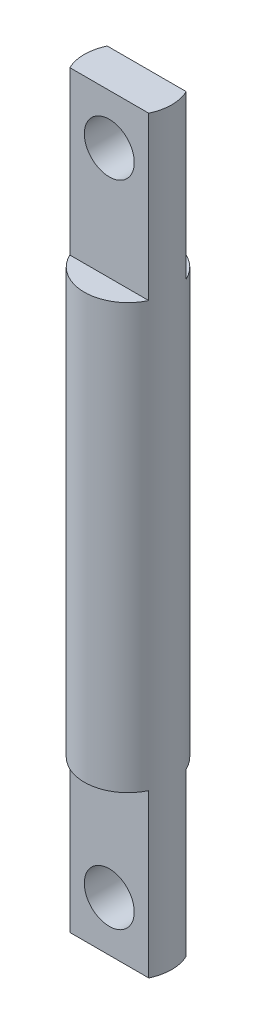
ISO-10303-21;
HEADER;
FILE_DESCRIPTION(('STEP AP214'),'2;1');
FILE_NAME('part.step','',(''),(''),'','','');
FILE_SCHEMA(('AUTOMOTIVE_DESIGN { 1 0 10303 214 1 1 1 1 }'));
ENDSEC;
DATA;
#1=APPLICATION_CONTEXT('core data for automotive mechanical design processes');
#2=APPLICATION_PROTOCOL_DEFINITION('international standard','automotive_design',2000,#1);
#3=PRODUCT_CONTEXT('',#1,'mechanical');
#4=PRODUCT('Part','Part','',(#3));
#5=PRODUCT_RELATED_PRODUCT_CATEGORY('part','',(#4));
#6=PRODUCT_DEFINITION_FORMATION('','',#4);
#7=PRODUCT_DEFINITION_CONTEXT('part definition',#1,'design');
#8=PRODUCT_DEFINITION('design','',#6,#7);
#9=PRODUCT_DEFINITION_SHAPE('','',#8);
#10=(LENGTH_UNIT() NAMED_UNIT(*) SI_UNIT(.MILLI.,.METRE.));
#11=(NAMED_UNIT(*) PLANE_ANGLE_UNIT() SI_UNIT($,.RADIAN.));
#12=(NAMED_UNIT(*) SI_UNIT($,.STERADIAN.) SOLID_ANGLE_UNIT());
#13=UNCERTAINTY_MEASURE_WITH_UNIT(LENGTH_MEASURE(1.E-05),#10,'distance_accuracy_value','');
#14=(GEOMETRIC_REPRESENTATION_CONTEXT(3) GLOBAL_UNCERTAINTY_ASSIGNED_CONTEXT((#13)) GLOBAL_UNIT_ASSIGNED_CONTEXT((#10,
#11,#12)) REPRESENTATION_CONTEXT('',''));
#15=CARTESIAN_POINT('',(0.,0.,0.));
#16=DIRECTION('',(0.,0.,1.));
#17=DIRECTION('',(1.,0.,0.));
#18=AXIS2_PLACEMENT_3D('',#15,#16,#17);
#19=CARTESIAN_POINT('',(0.,17.,0.));
#20=DIRECTION('',(0.,1.,0.));
#21=DIRECTION('',(0.,0.,1.));
#22=AXIS2_PLACEMENT_3D('',#19,#20,#21);
#23=PLANE('',#22);
#24=CARTESIAN_POINT('',(0.,17.,0.));
#25=DIRECTION('',(0.,1.,0.));
#26=DIRECTION('',(0.,0.,1.));
#27=AXIS2_PLACEMENT_3D('',#24,#25,#26);
#28=CIRCLE('',#27,3.5);
#29=CARTESIAN_POINT('',(3.16227766016838,17.,-1.5));
#30=VERTEX_POINT('',#29);
#31=CARTESIAN_POINT('',(-3.16227766016838,17.,-1.5));
#32=VERTEX_POINT('',#31);
#33=EDGE_CURVE('E65',#30,#32,#28,.T.);
#34=ORIENTED_EDGE('',*,*,#33,.T.);
#35=DIRECTION('',(1.,0.,0.));
#36=VECTOR('',#35,1.);
#37=CARTESIAN_POINT('',(0.,17.,-1.5));
#38=LINE('',#37,#36);
#39=EDGE_CURVE('E134',#32,#30,#38,.T.);
#40=ORIENTED_EDGE('',*,*,#39,.T.);
#41=EDGE_LOOP('',(#34,#40));
#42=FACE_BOUND('',#41,.T.);
#43=ADVANCED_FACE('F43',(#42),#23,.T.);
#44=CARTESIAN_POINT('',(0.,-17.,0.));
#45=DIRECTION('',(0.,1.,0.));
#46=DIRECTION('',(0.,0.,1.));
#47=AXIS2_PLACEMENT_3D('',#44,#45,#46);
#48=PLANE('',#47);
#49=DIRECTION('',(1.,0.,0.));
#50=VECTOR('',#49,1.);
#51=CARTESIAN_POINT('',(0.,-17.,-1.5));
#52=LINE('',#51,#50);
#53=CARTESIAN_POINT('',(-3.16227766016838,-17.,-1.5));
#54=VERTEX_POINT('',#53);
#55=CARTESIAN_POINT('',(3.16227766016838,-17.,-1.5));
#56=VERTEX_POINT('',#55);
#57=EDGE_CURVE('E160',#54,#56,#52,.T.);
#58=ORIENTED_EDGE('',*,*,#57,.F.);
#59=CARTESIAN_POINT('',(0.,-17.,0.));
#60=DIRECTION('',(0.,1.,0.));
#61=DIRECTION('',(0.,0.,1.));
#62=AXIS2_PLACEMENT_3D('',#59,#60,#61);
#63=CIRCLE('',#62,3.5);
#64=EDGE_CURVE('E11',#56,#54,#63,.T.);
#65=ORIENTED_EDGE('',*,*,#64,.F.);
#66=EDGE_LOOP('',(#58,#65));
#67=FACE_BOUND('',#66,.T.);
#68=ADVANCED_FACE('F218',(#67),#48,.F.);
#69=CARTESIAN_POINT('',(0.,-17.,0.));
#70=DIRECTION('',(0.,1.,0.));
#71=DIRECTION('',(0.,0.,1.));
#72=AXIS2_PLACEMENT_3D('',#69,#70,#71);
#73=CYLINDRICAL_SURFACE('',#72,3.5);
#74=CARTESIAN_POINT('',(-3.16227766016838,-17.,1.5));
#75=VERTEX_POINT('',#74);
#76=CARTESIAN_POINT('',(3.16227766016838,-17.,1.5));
#77=VERTEX_POINT('',#76);
#78=EDGE_CURVE('E47',#75,#77,#63,.T.);
#79=ORIENTED_EDGE('',*,*,#78,.T.);
#80=DIRECTION('',(0.,1.,0.));
#81=VECTOR('',#80,1.);
#82=CARTESIAN_POINT('',(3.16227766016838,-30.,1.5));
#83=LINE('',#82,#81);
#84=CARTESIAN_POINT('',(3.16227766016838,-30.,1.5));
#85=VERTEX_POINT('',#84);
#86=EDGE_CURVE('E186',#85,#77,#83,.T.);
#87=ORIENTED_EDGE('',*,*,#86,.F.);
#88=CARTESIAN_POINT('',(0.,-30.,0.));
#89=DIRECTION('',(0.,-1.,0.));
#90=DIRECTION('',(0.,0.,-1.));
#91=AXIS2_PLACEMENT_3D('',#88,#89,#90);
#92=CIRCLE('',#91,3.5);
#93=CARTESIAN_POINT('',(3.16227766016838,-30.,-1.5));
#94=VERTEX_POINT('',#93);
#95=EDGE_CURVE('E170',#94,#85,#92,.T.);
#96=ORIENTED_EDGE('',*,*,#95,.F.);
#97=DIRECTION('',(0.,1.,0.));
#98=VECTOR('',#97,1.);
#99=CARTESIAN_POINT('',(3.16227766016838,-30.,-1.5));
#100=LINE('',#99,#98);
#101=EDGE_CURVE('E190',#94,#56,#100,.T.);
#102=ORIENTED_EDGE('',*,*,#101,.T.);
#103=ORIENTED_EDGE('',*,*,#64,.T.);
#104=DIRECTION('',(0.,1.,0.));
#105=VECTOR('',#104,1.);
#106=CARTESIAN_POINT('',(-3.16227766016838,-30.,-1.5));
#107=LINE('',#106,#105);
#108=CARTESIAN_POINT('',(-3.16227766016838,-30.,-1.5));
#109=VERTEX_POINT('',#108);
#110=EDGE_CURVE('E194',#109,#54,#107,.T.);
#111=ORIENTED_EDGE('',*,*,#110,.F.);
#112=CARTESIAN_POINT('',(-3.16227766016838,-30.,1.5));
#113=VERTEX_POINT('',#112);
#114=EDGE_CURVE('E164',#113,#109,#92,.T.);
#115=ORIENTED_EDGE('',*,*,#114,.F.);
#116=DIRECTION('',(0.,1.,0.));
#117=VECTOR('',#116,1.);
#118=CARTESIAN_POINT('',(-3.16227766016838,-30.,1.5));
#119=LINE('',#118,#117);
#120=EDGE_CURVE('E177',#113,#75,#119,.T.);
#121=ORIENTED_EDGE('',*,*,#120,.T.);
#122=EDGE_LOOP('',(#79,#87,#96,#102,#103,#111,#115,#121));
#123=FACE_BOUND('',#122,.T.);
#124=ORIENTED_EDGE('',*,*,#33,.F.);
#125=DIRECTION('',(0.,-1.,0.));
#126=VECTOR('',#125,1.);
#127=CARTESIAN_POINT('',(3.16227766016838,30.,-1.5));
#128=LINE('',#127,#126);
#129=CARTESIAN_POINT('',(3.16227766016838,30.,-1.5));
#130=VERTEX_POINT('',#129);
#131=EDGE_CURVE('E146',#130,#30,#128,.T.);
#132=ORIENTED_EDGE('',*,*,#131,.F.);
#133=CARTESIAN_POINT('',(0.,30.,0.));
#134=DIRECTION('',(0.,-1.,0.));
#135=DIRECTION('',(0.,0.,-1.));
#136=AXIS2_PLACEMENT_3D('',#133,#134,#135);
#137=CIRCLE('',#136,3.5);
#138=CARTESIAN_POINT('',(3.16227766016838,30.,1.5));
#139=VERTEX_POINT('',#138);
#140=EDGE_CURVE('E128',#130,#139,#137,.T.);
#141=ORIENTED_EDGE('',*,*,#140,.T.);
#142=DIRECTION('',(0.,-1.,0.));
#143=VECTOR('',#142,1.);
#144=CARTESIAN_POINT('',(3.16227766016838,30.,1.5));
#145=LINE('',#144,#143);
#146=CARTESIAN_POINT('',(3.16227766016838,17.,1.5));
#147=VERTEX_POINT('',#146);
#148=EDGE_CURVE('E119',#139,#147,#145,.T.);
#149=ORIENTED_EDGE('',*,*,#148,.T.);
#150=CARTESIAN_POINT('',(-3.16227766016838,17.,1.5));
#151=VERTEX_POINT('',#150);
#152=EDGE_CURVE('E115',#151,#147,#28,.T.);
#153=ORIENTED_EDGE('',*,*,#152,.F.);
#154=DIRECTION('',(0.,-1.,0.));
#155=VECTOR('',#154,1.);
#156=CARTESIAN_POINT('',(-3.16227766016838,30.,1.5));
#157=LINE('',#156,#155);
#158=CARTESIAN_POINT('',(-3.16227766016838,30.,1.5));
#159=VERTEX_POINT('',#158);
#160=EDGE_CURVE('E109',#159,#151,#157,.T.);
#161=ORIENTED_EDGE('',*,*,#160,.F.);
#162=CARTESIAN_POINT('',(-3.16227766016838,30.,-1.5));
#163=VERTEX_POINT('',#162);
#164=EDGE_CURVE('E112',#159,#163,#137,.T.);
#165=ORIENTED_EDGE('',*,*,#164,.T.);
#166=DIRECTION('',(0.,-1.,0.));
#167=VECTOR('',#166,1.);
#168=CARTESIAN_POINT('',(-3.16227766016838,30.,-1.5));
#169=LINE('',#168,#167);
#170=EDGE_CURVE('E141',#163,#32,#169,.T.);
#171=ORIENTED_EDGE('',*,*,#170,.T.);
#172=EDGE_LOOP('',(#124,#132,#141,#149,#153,#161,#165,#171));
#173=FACE_BOUND('',#172,.T.);
#174=ADVANCED_FACE('F45',(#123,#173),#73,.T.);
#175=ORIENTED_EDGE('',*,*,#78,.F.);
#176=DIRECTION('',(1.,0.,0.));
#177=VECTOR('',#176,1.);
#178=CARTESIAN_POINT('',(0.,-17.,1.5));
#179=LINE('',#178,#177);
#180=EDGE_CURVE('E169',#75,#77,#179,.T.);
#181=ORIENTED_EDGE('',*,*,#180,.T.);
#182=EDGE_LOOP('',(#175,#181));
#183=FACE_BOUND('',#182,.T.);
#184=ADVANCED_FACE('F220',(#183),#48,.F.);
#185=DIRECTION('',(1.,0.,0.));
#186=VECTOR('',#185,1.);
#187=CARTESIAN_POINT('',(0.,17.,1.5));
#188=LINE('',#187,#186);
#189=EDGE_CURVE('E58',#151,#147,#188,.T.);
#190=ORIENTED_EDGE('',*,*,#189,.F.);
#191=ORIENTED_EDGE('',*,*,#152,.T.);
#192=EDGE_LOOP('',(#190,#191));
#193=FACE_BOUND('',#192,.T.);
#194=ADVANCED_FACE('F226',(#193),#23,.T.);
#195=CARTESIAN_POINT('',(0.,-30.,-1.5));
#196=DIRECTION('',(0.,0.,1.));
#197=DIRECTION('',(1.,0.,0.));
#198=AXIS2_PLACEMENT_3D('',#195,#196,#197);
#199=PLANE('',#198);
#200=CARTESIAN_POINT('',(0.,-26.,-1.5));
#201=DIRECTION('',(0.,0.,-1.));
#202=DIRECTION('',(-1.,0.,0.));
#203=AXIS2_PLACEMENT_3D('',#200,#201,#202);
#204=CIRCLE('',#203,2.);
#205=CARTESIAN_POINT('',(-2.,-26.,-1.5));
#206=VERTEX_POINT('',#205);
#207=EDGE_CURVE('E156',#206,#206,#204,.T.);
#208=ORIENTED_EDGE('',*,*,#207,.F.);
#209=EDGE_LOOP('',(#208));
#210=FACE_BOUND('',#209,.T.);
#211=ORIENTED_EDGE('',*,*,#57,.T.);
#212=ORIENTED_EDGE('',*,*,#101,.F.);
#213=DIRECTION('',(1.,0.,0.));
#214=VECTOR('',#213,1.);
#215=CARTESIAN_POINT('',(0.,-30.,-1.5));
#216=LINE('',#215,#214);
#217=EDGE_CURVE('E168',#109,#94,#216,.T.);
#218=ORIENTED_EDGE('',*,*,#217,.F.);
#219=ORIENTED_EDGE('',*,*,#110,.T.);
#220=EDGE_LOOP('',(#211,#212,#218,#219));
#221=FACE_BOUND('',#220,.T.);
#222=ADVANCED_FACE('F216',(#210,#221),#199,.F.);
#223=CARTESIAN_POINT('',(0.,-30.,1.5));
#224=DIRECTION('',(0.,0.,1.));
#225=DIRECTION('',(1.,0.,0.));
#226=AXIS2_PLACEMENT_3D('',#223,#224,#225);
#227=PLANE('',#226);
#228=CARTESIAN_POINT('',(0.,-26.,1.5));
#229=DIRECTION('',(0.,0.,1.));
#230=DIRECTION('',(1.,0.,0.));
#231=AXIS2_PLACEMENT_3D('',#228,#229,#230);
#232=CIRCLE('',#231,2.);
#233=CARTESIAN_POINT('',(2.,-26.,1.5));
#234=VERTEX_POINT('',#233);
#235=EDGE_CURVE('E118',#234,#234,#232,.F.);
#236=ORIENTED_EDGE('',*,*,#235,.T.);
#237=EDGE_LOOP('',(#236));
#238=FACE_BOUND('',#237,.T.);
#239=ORIENTED_EDGE('',*,*,#180,.F.);
#240=ORIENTED_EDGE('',*,*,#120,.F.);
#241=DIRECTION('',(1.,0.,0.));
#242=VECTOR('',#241,1.);
#243=CARTESIAN_POINT('',(0.,-30.,1.5));
#244=LINE('',#243,#242);
#245=EDGE_CURVE('E173',#113,#85,#244,.T.);
#246=ORIENTED_EDGE('',*,*,#245,.T.);
#247=ORIENTED_EDGE('',*,*,#86,.T.);
#248=EDGE_LOOP('',(#239,#240,#246,#247));
#249=FACE_BOUND('',#248,.T.);
#250=ADVANCED_FACE('F208',(#238,#249),#227,.T.);
#251=CARTESIAN_POINT('',(0.,-30.,0.));
#252=DIRECTION('',(0.,-1.,0.));
#253=DIRECTION('',(0.,0.,-1.));
#254=AXIS2_PLACEMENT_3D('',#251,#252,#253);
#255=PLANE('',#254);
#256=ORIENTED_EDGE('',*,*,#114,.T.);
#257=ORIENTED_EDGE('',*,*,#217,.T.);
#258=ORIENTED_EDGE('',*,*,#95,.T.);
#259=ORIENTED_EDGE('',*,*,#245,.F.);
#260=EDGE_LOOP('',(#256,#257,#258,#259));
#261=FACE_BOUND('',#260,.T.);
#262=ADVANCED_FACE('F211',(#261),#255,.T.);
#263=CARTESIAN_POINT('',(0.,-26.,3.501));
#264=DIRECTION('',(0.,0.,-1.));
#265=DIRECTION('',(-1.,0.,0.));
#266=AXIS2_PLACEMENT_3D('',#263,#264,#265);
#267=CYLINDRICAL_SURFACE('',#266,2.);
#268=ORIENTED_EDGE('',*,*,#235,.F.);
#269=EDGE_LOOP('',(#268));
#270=FACE_BOUND('',#269,.T.);
#271=ORIENTED_EDGE('',*,*,#207,.T.);
#272=EDGE_LOOP('',(#271));
#273=FACE_BOUND('',#272,.T.);
#274=ADVANCED_FACE('F242',(#270,#273),#267,.F.);
#275=CARTESIAN_POINT('',(0.,30.,1.5));
#276=DIRECTION('',(0.,0.,-1.));
#277=DIRECTION('',(-1.,0.,0.));
#278=AXIS2_PLACEMENT_3D('',#275,#276,#277);
#279=PLANE('',#278);
#280=CARTESIAN_POINT('',(0.,26.,1.5));
#281=DIRECTION('',(0.,0.,-1.));
#282=DIRECTION('',(-1.,0.,0.));
#283=AXIS2_PLACEMENT_3D('',#280,#281,#282);
#284=CIRCLE('',#283,2.);
#285=CARTESIAN_POINT('',(-2.,26.,1.5));
#286=VERTEX_POINT('',#285);
#287=EDGE_CURVE('E265',#286,#286,#284,.T.);
#288=ORIENTED_EDGE('',*,*,#287,.T.);
#289=EDGE_LOOP('',(#288));
#290=FACE_BOUND('',#289,.T.);
#291=ORIENTED_EDGE('',*,*,#189,.T.);
#292=ORIENTED_EDGE('',*,*,#148,.F.);
#293=DIRECTION('',(1.,0.,0.));
#294=VECTOR('',#293,1.);
#295=CARTESIAN_POINT('',(0.,30.,1.5));
#296=LINE('',#295,#294);
#297=EDGE_CURVE('E122',#159,#139,#296,.T.);
#298=ORIENTED_EDGE('',*,*,#297,.F.);
#299=ORIENTED_EDGE('',*,*,#160,.T.);
#300=EDGE_LOOP('',(#291,#292,#298,#299));
#301=FACE_BOUND('',#300,.T.);
#302=ADVANCED_FACE('F123',(#290,#301),#279,.F.);
#303=CARTESIAN_POINT('',(0.,30.,-1.5));
#304=DIRECTION('',(0.,0.,-1.));
#305=DIRECTION('',(-1.,0.,0.));
#306=AXIS2_PLACEMENT_3D('',#303,#304,#305);
#307=PLANE('',#306);
#308=CARTESIAN_POINT('',(0.,26.,-1.5));
#309=DIRECTION('',(0.,0.,1.));
#310=DIRECTION('',(-1.,0.,0.));
#311=AXIS2_PLACEMENT_3D('',#308,#309,#310);
#312=CIRCLE('',#311,2.);
#313=CARTESIAN_POINT('',(-2.,26.,-1.5));
#314=VERTEX_POINT('',#313);
#315=EDGE_CURVE('E150',#314,#314,#312,.T.);
#316=ORIENTED_EDGE('',*,*,#315,.T.);
#317=EDGE_LOOP('',(#316));
#318=FACE_BOUND('',#317,.T.);
#319=ORIENTED_EDGE('',*,*,#39,.F.);
#320=ORIENTED_EDGE('',*,*,#170,.F.);
#321=DIRECTION('',(1.,0.,0.));
#322=VECTOR('',#321,1.);
#323=CARTESIAN_POINT('',(0.,30.,-1.5));
#324=LINE('',#323,#322);
#325=EDGE_CURVE('E132',#163,#130,#324,.T.);
#326=ORIENTED_EDGE('',*,*,#325,.T.);
#327=ORIENTED_EDGE('',*,*,#131,.T.);
#328=EDGE_LOOP('',(#319,#320,#326,#327));
#329=FACE_BOUND('',#328,.T.);
#330=ADVANCED_FACE('F248',(#318,#329),#307,.T.);
#331=CARTESIAN_POINT('',(0.,30.,0.));
#332=DIRECTION('',(0.,1.,0.));
#333=DIRECTION('',(0.,0.,-1.));
#334=AXIS2_PLACEMENT_3D('',#331,#332,#333);
#335=PLANE('',#334);
#336=ORIENTED_EDGE('',*,*,#164,.F.);
#337=ORIENTED_EDGE('',*,*,#297,.T.);
#338=ORIENTED_EDGE('',*,*,#140,.F.);
#339=ORIENTED_EDGE('',*,*,#325,.F.);
#340=EDGE_LOOP('',(#336,#337,#338,#339));
#341=FACE_BOUND('',#340,.T.);
#342=ADVANCED_FACE('F130',(#341),#335,.T.);
#343=CARTESIAN_POINT('',(0.,26.,3.501));
#344=DIRECTION('',(0.,0.,-1.));
#345=DIRECTION('',(-1.,0.,0.));
#346=AXIS2_PLACEMENT_3D('',#343,#344,#345);
#347=CYLINDRICAL_SURFACE('',#346,2.);
#348=ORIENTED_EDGE('',*,*,#315,.F.);
#349=EDGE_LOOP('',(#348));
#350=FACE_BOUND('',#349,.T.);
#351=ORIENTED_EDGE('',*,*,#287,.F.);
#352=EDGE_LOOP('',(#351));
#353=FACE_BOUND('',#352,.T.);
#354=ADVANCED_FACE('F255',(#350,#353),#347,.F.);
#355=CLOSED_SHELL('',(#43,#68,#174,#184,#194,#222,#250,#262,#274,#302,#330,#342,#354));
#356=MANIFOLD_SOLID_BREP('B2',#355);
#357=ADVANCED_BREP_SHAPE_REPRESENTATION('',(#18,#356),#14);
#358=SHAPE_DEFINITION_REPRESENTATION(#9,#357);
ENDSEC;
END-ISO-10303-21;
